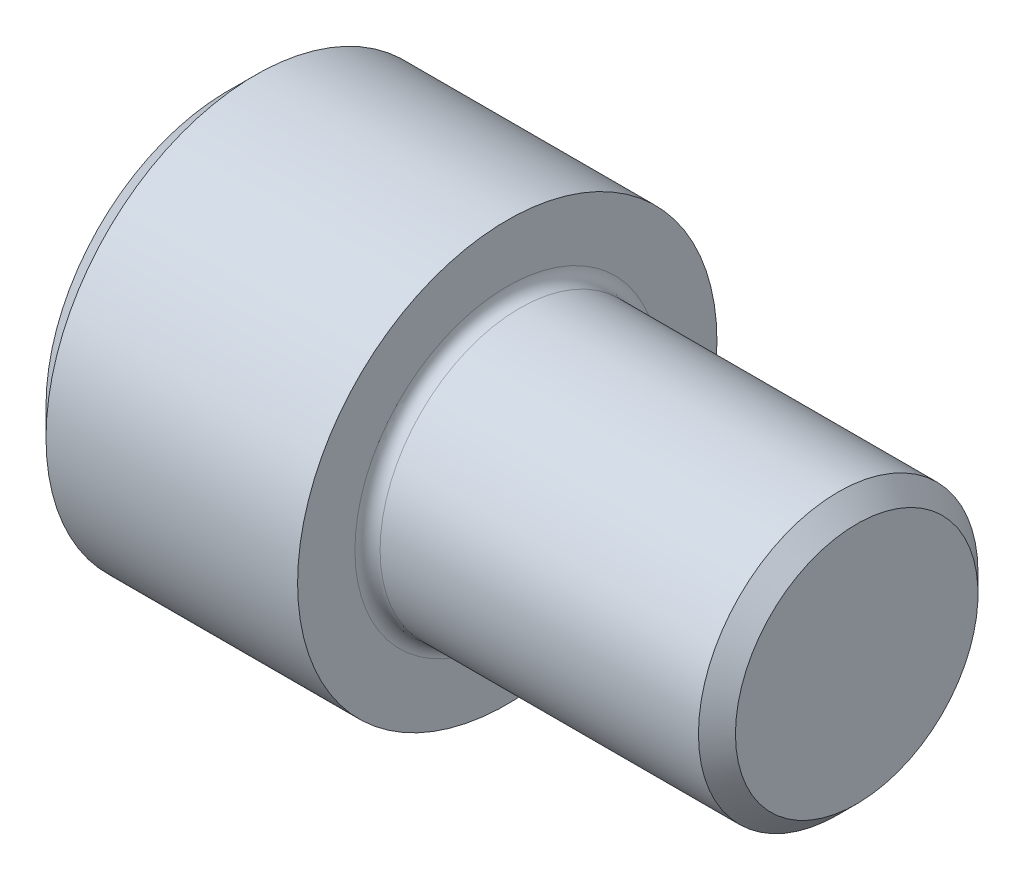
ISO-10303-21;
HEADER;
FILE_DESCRIPTION(('STEP AP214'),'2;1');
FILE_NAME('part.step','',(''),(''),'','','');
FILE_SCHEMA(('AUTOMOTIVE_DESIGN { 1 0 10303 214 1 1 1 1 }'));
ENDSEC;
DATA;
#1=APPLICATION_CONTEXT('core data for automotive mechanical design processes');
#2=APPLICATION_PROTOCOL_DEFINITION('international standard','automotive_design',2000,#1);
#3=PRODUCT_CONTEXT('',#1,'mechanical');
#4=PRODUCT('Part','Part','',(#3));
#5=PRODUCT_RELATED_PRODUCT_CATEGORY('part','',(#4));
#6=PRODUCT_DEFINITION_FORMATION('','',#4);
#7=PRODUCT_DEFINITION_CONTEXT('part definition',#1,'design');
#8=PRODUCT_DEFINITION('design','',#6,#7);
#9=PRODUCT_DEFINITION_SHAPE('','',#8);
#10=(LENGTH_UNIT() NAMED_UNIT(*) SI_UNIT(.MILLI.,.METRE.));
#11=(NAMED_UNIT(*) PLANE_ANGLE_UNIT() SI_UNIT($,.RADIAN.));
#12=(NAMED_UNIT(*) SI_UNIT($,.STERADIAN.) SOLID_ANGLE_UNIT());
#13=UNCERTAINTY_MEASURE_WITH_UNIT(LENGTH_MEASURE(1.E-05),#10,'distance_accuracy_value','');
#14=(GEOMETRIC_REPRESENTATION_CONTEXT(3) GLOBAL_UNCERTAINTY_ASSIGNED_CONTEXT((#13)) GLOBAL_UNIT_ASSIGNED_CONTEXT((#10,
#11,#12)) REPRESENTATION_CONTEXT('',''));
#15=CARTESIAN_POINT('',(0.,0.,0.));
#16=DIRECTION('',(0.,0.,1.));
#17=DIRECTION('',(1.,0.,0.));
#18=AXIS2_PLACEMENT_3D('',#15,#16,#17);
#19=CARTESIAN_POINT('',(0.,0.,0.));
#20=DIRECTION('',(-1.,0.,0.));
#21=DIRECTION('',(0.,0.,1.));
#22=AXIS2_PLACEMENT_3D('',#19,#20,#21);
#23=PLANE('',#22);
#24=DIRECTION('',(0.,-0.499999999999998,0.86602540378444));
#25=VECTOR('',#24,1.);
#26=CARTESIAN_POINT('',(0.,21.9970452561247,0.));
#27=LINE('',#26,#25);
#28=CARTESIAN_POINT('',(0.,21.9970452561247,0.));
#29=VERTEX_POINT('',#28);
#30=CARTESIAN_POINT('',(0.,10.9985226280624,19.05));
#31=VERTEX_POINT('',#30);
#32=EDGE_CURVE('E265',#29,#31,#27,.T.);
#33=ORIENTED_EDGE('',*,*,#32,.T.);
#34=DIRECTION('',(0.,1.,0.));
#35=VECTOR('',#34,1.);
#36=CARTESIAN_POINT('',(0.,-10.9985226280623,19.05));
#37=LINE('',#36,#35);
#38=CARTESIAN_POINT('',(0.,-10.9985226280623,19.05));
#39=VERTEX_POINT('',#38);
#40=EDGE_CURVE('E125',#39,#31,#37,.T.);
#41=ORIENTED_EDGE('',*,*,#40,.F.);
#42=DIRECTION('',(0.,-0.500000000000001,-0.866025403784438));
#43=VECTOR('',#42,1.);
#44=CARTESIAN_POINT('',(0.,-10.9985226280623,19.05));
#45=LINE('',#44,#43);
#46=CARTESIAN_POINT('',(0.,-21.9970452561247,0.));
#47=VERTEX_POINT('',#46);
#48=EDGE_CURVE('E268',#39,#47,#45,.T.);
#49=ORIENTED_EDGE('',*,*,#48,.T.);
#50=DIRECTION('',(0.,0.499999999999998,-0.86602540378444));
#51=VECTOR('',#50,1.);
#52=CARTESIAN_POINT('',(0.,-21.9970452561247,0.));
#53=LINE('',#52,#51);
#54=CARTESIAN_POINT('',(0.,-10.9985226280624,-19.05));
#55=VERTEX_POINT('',#54);
#56=EDGE_CURVE('E271',#47,#55,#53,.T.);
#57=ORIENTED_EDGE('',*,*,#56,.T.);
#58=DIRECTION('',(0.,-1.,0.));
#59=VECTOR('',#58,1.);
#60=CARTESIAN_POINT('',(0.,10.9985226280623,-19.05));
#61=LINE('',#60,#59);
#62=CARTESIAN_POINT('',(0.,10.9985226280623,-19.05));
#63=VERTEX_POINT('',#62);
#64=EDGE_CURVE('E274',#63,#55,#61,.T.);
#65=ORIENTED_EDGE('',*,*,#64,.F.);
#66=DIRECTION('',(0.,-0.500000000000001,-0.866025403784438));
#67=VECTOR('',#66,1.);
#68=CARTESIAN_POINT('',(0.,21.9970452561247,0.));
#69=LINE('',#68,#67);
#70=EDGE_CURVE('E120',#29,#63,#69,.T.);
#71=ORIENTED_EDGE('',*,*,#70,.F.);
#72=EDGE_LOOP('',(#33,#41,#49,#57,#65,#71));
#73=FACE_BOUND('',#72,.T.);
#74=CARTESIAN_POINT('',(0.,0.,0.));
#75=DIRECTION('',(-1.,0.,0.));
#76=DIRECTION('',(0.,0.,1.));
#77=AXIS2_PLACEMENT_3D('',#74,#75,#76);
#78=CIRCLE('',#77,33.02);
#79=CARTESIAN_POINT('',(0.,0.,33.02));
#80=VERTEX_POINT('',#79);
#81=EDGE_CURVE('E149',#80,#80,#78,.T.);
#82=ORIENTED_EDGE('',*,*,#81,.T.);
#83=EDGE_LOOP('',(#82));
#84=FACE_BOUND('',#83,.T.);
#85=ADVANCED_FACE('F33',(#73,#84),#23,.T.);
#86=CARTESIAN_POINT('',(0.,0.,0.));
#87=DIRECTION('',(1.,0.,0.));
#88=DIRECTION('',(0.,0.,-1.));
#89=AXIS2_PLACEMENT_3D('',#86,#87,#88);
#90=CONICAL_SURFACE('',#89,33.02,0.785398163397448);
#91=CARTESIAN_POINT('',(5.07999999999999,0.,0.));
#92=DIRECTION('',(-1.,0.,0.));
#93=DIRECTION('',(0.,0.,1.));
#94=AXIS2_PLACEMENT_3D('',#91,#92,#93);
#95=CIRCLE('',#94,38.1);
#96=CARTESIAN_POINT('',(5.07999999999999,0.,38.1));
#97=VERTEX_POINT('',#96);
#98=EDGE_CURVE('E146',#97,#97,#95,.T.);
#99=ORIENTED_EDGE('',*,*,#98,.T.);
#100=EDGE_LOOP('',(#99));
#101=FACE_BOUND('',#100,.T.);
#102=ORIENTED_EDGE('',*,*,#81,.F.);
#103=EDGE_LOOP('',(#102));
#104=FACE_BOUND('',#103,.T.);
#105=ADVANCED_FACE('F170',(#101,#104),#90,.T.);
#106=CARTESIAN_POINT('',(-31.75,0.,0.));
#107=DIRECTION('',(-1.,0.,0.));
#108=DIRECTION('',(0.,0.,1.));
#109=AXIS2_PLACEMENT_3D('',#106,#107,#108);
#110=CYLINDRICAL_SURFACE('',#109,38.1);
#111=CARTESIAN_POINT('',(50.8,0.,0.));
#112=DIRECTION('',(-1.,0.,0.));
#113=DIRECTION('',(0.,0.,1.));
#114=AXIS2_PLACEMENT_3D('',#111,#112,#113);
#115=CIRCLE('',#114,38.1);
#116=CARTESIAN_POINT('',(50.8,0.,38.1));
#117=VERTEX_POINT('',#116);
#118=EDGE_CURVE('E143',#117,#117,#115,.T.);
#119=ORIENTED_EDGE('',*,*,#118,.T.);
#120=EDGE_LOOP('',(#119));
#121=FACE_BOUND('',#120,.T.);
#122=ORIENTED_EDGE('',*,*,#98,.F.);
#123=EDGE_LOOP('',(#122));
#124=FACE_BOUND('',#123,.T.);
#125=ADVANCED_FACE('F175',(#121,#124),#110,.T.);
#126=CARTESIAN_POINT('',(50.8,38.1,0.));
#127=DIRECTION('',(1.,0.,0.));
#128=DIRECTION('',(0.,0.,-1.));
#129=AXIS2_PLACEMENT_3D('',#126,#127,#128);
#130=PLANE('',#129);
#131=CARTESIAN_POINT('',(50.8,0.,0.));
#132=DIRECTION('',(1.,0.,0.));
#133=DIRECTION('',(0.,0.,-1.));
#134=AXIS2_PLACEMENT_3D('',#131,#132,#133);
#135=CIRCLE('',#134,27.686);
#136=CARTESIAN_POINT('',(50.8,0.,-27.686));
#137=VERTEX_POINT('',#136);
#138=EDGE_CURVE('E41',#137,#137,#135,.F.);
#139=ORIENTED_EDGE('',*,*,#138,.T.);
#140=EDGE_LOOP('',(#139));
#141=FACE_BOUND('',#140,.T.);
#142=ORIENTED_EDGE('',*,*,#118,.F.);
#143=EDGE_LOOP('',(#142));
#144=FACE_BOUND('',#143,.T.);
#145=ADVANCED_FACE('F154',(#141,#144),#130,.T.);
#146=CARTESIAN_POINT('',(-31.75,0.,0.));
#147=DIRECTION('',(-1.,0.,0.));
#148=DIRECTION('',(0.,0.,1.));
#149=AXIS2_PLACEMENT_3D('',#146,#147,#148);
#150=CYLINDRICAL_SURFACE('',#149,25.4);
#151=CARTESIAN_POINT('',(53.086,0.,0.));
#152=DIRECTION('',(1.,0.,0.));
#153=DIRECTION('',(0.,0.,-1.));
#154=AXIS2_PLACEMENT_3D('',#151,#152,#153);
#155=CIRCLE('',#154,25.4);
#156=CARTESIAN_POINT('',(53.086,0.,-25.4));
#157=VERTEX_POINT('',#156);
#158=EDGE_CURVE('E11',#157,#157,#155,.T.);
#159=ORIENTED_EDGE('',*,*,#158,.T.);
#160=EDGE_LOOP('',(#159));
#161=FACE_BOUND('',#160,.T.);
#162=CARTESIAN_POINT('',(110.93831,0.,0.));
#163=DIRECTION('',(-1.,0.,0.));
#164=DIRECTION('',(0.,0.,1.));
#165=AXIS2_PLACEMENT_3D('',#162,#163,#164);
#166=CIRCLE('',#165,25.4);
#167=CARTESIAN_POINT('',(110.93831,0.,25.4));
#168=VERTEX_POINT('',#167);
#169=EDGE_CURVE('E140',#168,#168,#166,.T.);
#170=ORIENTED_EDGE('',*,*,#169,.T.);
#171=EDGE_LOOP('',(#170));
#172=FACE_BOUND('',#171,.T.);
#173=ADVANCED_FACE('F185',(#161,#172),#150,.T.);
#174=CARTESIAN_POINT('',(114.3,0.,0.));
#175=DIRECTION('',(-1.,0.,0.));
#176=DIRECTION('',(0.,0.,1.));
#177=AXIS2_PLACEMENT_3D('',#174,#175,#176);
#178=CONICAL_SURFACE('',#177,22.03831,0.78539816339747);
#179=ORIENTED_EDGE('',*,*,#169,.F.);
#180=EDGE_LOOP('',(#179));
#181=FACE_BOUND('',#180,.T.);
#182=CARTESIAN_POINT('',(114.3,0.,0.));
#183=DIRECTION('',(-1.,0.,0.));
#184=DIRECTION('',(0.,0.,1.));
#185=AXIS2_PLACEMENT_3D('',#182,#183,#184);
#186=CIRCLE('',#185,22.03831);
#187=CARTESIAN_POINT('',(114.3,0.,22.03831));
#188=VERTEX_POINT('',#187);
#189=EDGE_CURVE('E136',#188,#188,#186,.T.);
#190=ORIENTED_EDGE('',*,*,#189,.T.);
#191=EDGE_LOOP('',(#190));
#192=FACE_BOUND('',#191,.T.);
#193=ADVANCED_FACE('F165',(#181,#192),#178,.T.);
#194=CARTESIAN_POINT('',(114.3,22.03831,0.));
#195=DIRECTION('',(1.,0.,0.));
#196=DIRECTION('',(0.,0.,-1.));
#197=AXIS2_PLACEMENT_3D('',#194,#195,#196);
#198=PLANE('',#197);
#199=ORIENTED_EDGE('',*,*,#189,.F.);
#200=EDGE_LOOP('',(#199));
#201=FACE_BOUND('',#200,.T.);
#202=ADVANCED_FACE('F158',(#201),#198,.T.);
#203=CARTESIAN_POINT('',(53.086,0.,0.));
#204=DIRECTION('',(1.,0.,0.));
#205=DIRECTION('',(0.,0.,-1.));
#206=AXIS2_PLACEMENT_3D('',#203,#204,#205);
#207=TOROIDAL_SURFACE('',#206,27.686,2.286);
#208=ORIENTED_EDGE('',*,*,#158,.F.);
#209=EDGE_LOOP('',(#208));
#210=FACE_BOUND('',#209,.T.);
#211=ORIENTED_EDGE('',*,*,#138,.F.);
#212=EDGE_LOOP('',(#211));
#213=FACE_BOUND('',#212,.T.);
#214=ADVANCED_FACE('F35',(#210,#213),#207,.F.);
#215=CARTESIAN_POINT('',(25.273,21.9970452561247,0.));
#216=DIRECTION('',(0.,-0.86602540378444,-0.499999999999998));
#217=DIRECTION('',(0.,0.499999999999998,-0.86602540378444));
#218=AXIS2_PLACEMENT_3D('',#215,#216,#217);
#219=PLANE('',#218);
#220=ORIENTED_EDGE('',*,*,#32,.F.);
#221=DIRECTION('',(-1.,0.,0.));
#222=VECTOR('',#221,1.);
#223=CARTESIAN_POINT('',(25.273,21.9970452561247,0.));
#224=LINE('',#223,#222);
#225=CARTESIAN_POINT('',(25.273,21.9970452561247,0.));
#226=VERTEX_POINT('',#225);
#227=EDGE_CURVE('E264',#226,#29,#224,.T.);
#228=ORIENTED_EDGE('',*,*,#227,.F.);
#229=DIRECTION('',(0.,-0.499999999999998,0.86602540378444));
#230=VECTOR('',#229,1.);
#231=CARTESIAN_POINT('',(25.273,21.9970452561247,0.));
#232=LINE('',#231,#230);
#233=CARTESIAN_POINT('',(25.273,16.4977839420936,9.52499999999997));
#234=VERTEX_POINT('',#233);
#235=EDGE_CURVE('E48',#226,#234,#232,.T.);
#236=ORIENTED_EDGE('',*,*,#235,.T.);
#237=CARTESIAN_POINT('',(25.273,10.9985226280624,19.05));
#238=VERTEX_POINT('',#237);
#239=EDGE_CURVE('E106',#234,#238,#232,.T.);
#240=ORIENTED_EDGE('',*,*,#239,.T.);
#241=DIRECTION('',(-1.,0.,0.));
#242=VECTOR('',#241,1.);
#243=CARTESIAN_POINT('',(25.273,10.9985226280624,19.05));
#244=LINE('',#243,#242);
#245=EDGE_CURVE('E118',#238,#31,#244,.T.);
#246=ORIENTED_EDGE('',*,*,#245,.T.);
#247=EDGE_LOOP('',(#220,#228,#236,#240,#246));
#248=FACE_BOUND('',#247,.T.);
#249=ADVANCED_FACE('F117',(#248),#219,.T.);
#250=CARTESIAN_POINT('',(25.273,-10.9985226280623,19.05));
#251=DIRECTION('',(0.,0.,1.));
#252=DIRECTION('',(0.,-1.,0.));
#253=AXIS2_PLACEMENT_3D('',#250,#251,#252);
#254=PLANE('',#253);
#255=ORIENTED_EDGE('',*,*,#40,.T.);
#256=ORIENTED_EDGE('',*,*,#245,.F.);
#257=DIRECTION('',(0.,1.,0.));
#258=VECTOR('',#257,1.);
#259=CARTESIAN_POINT('',(25.273,-10.9985226280623,19.05));
#260=LINE('',#259,#258);
#261=CARTESIAN_POINT('',(25.273,0.,19.05));
#262=VERTEX_POINT('',#261);
#263=EDGE_CURVE('E104',#262,#238,#260,.T.);
#264=ORIENTED_EDGE('',*,*,#263,.F.);
#265=CARTESIAN_POINT('',(25.273,-10.9985226280623,19.05));
#266=VERTEX_POINT('',#265);
#267=EDGE_CURVE('E114',#266,#262,#260,.T.);
#268=ORIENTED_EDGE('',*,*,#267,.F.);
#269=DIRECTION('',(-1.,0.,0.));
#270=VECTOR('',#269,1.);
#271=CARTESIAN_POINT('',(25.273,-10.9985226280623,19.05));
#272=LINE('',#271,#270);
#273=EDGE_CURVE('E127',#266,#39,#272,.T.);
#274=ORIENTED_EDGE('',*,*,#273,.T.);
#275=EDGE_LOOP('',(#255,#256,#264,#268,#274));
#276=FACE_BOUND('',#275,.T.);
#277=ADVANCED_FACE('F122',(#276),#254,.F.);
#278=CARTESIAN_POINT('',(25.273,-10.9985226280623,19.05));
#279=DIRECTION('',(0.,0.866025403784438,-0.500000000000001));
#280=DIRECTION('',(0.,0.500000000000001,0.866025403784438));
#281=AXIS2_PLACEMENT_3D('',#278,#279,#280);
#282=PLANE('',#281);
#283=ORIENTED_EDGE('',*,*,#48,.F.);
#284=ORIENTED_EDGE('',*,*,#273,.F.);
#285=DIRECTION('',(0.,-0.500000000000001,-0.866025403784438));
#286=VECTOR('',#285,1.);
#287=CARTESIAN_POINT('',(25.273,-10.9985226280623,19.05));
#288=LINE('',#287,#286);
#289=CARTESIAN_POINT('',(25.273,-16.4977839420935,9.52500000000002));
#290=VERTEX_POINT('',#289);
#291=EDGE_CURVE('E245',#266,#290,#288,.T.);
#292=ORIENTED_EDGE('',*,*,#291,.T.);
#293=CARTESIAN_POINT('',(25.273,-21.9970452561247,0.));
#294=VERTEX_POINT('',#293);
#295=EDGE_CURVE('E247',#290,#294,#288,.T.);
#296=ORIENTED_EDGE('',*,*,#295,.T.);
#297=DIRECTION('',(-1.,0.,0.));
#298=VECTOR('',#297,1.);
#299=CARTESIAN_POINT('',(25.273,-21.9970452561247,0.));
#300=LINE('',#299,#298);
#301=EDGE_CURVE('E132',#294,#47,#300,.T.);
#302=ORIENTED_EDGE('',*,*,#301,.T.);
#303=EDGE_LOOP('',(#283,#284,#292,#296,#302));
#304=FACE_BOUND('',#303,.T.);
#305=ADVANCED_FACE('F197',(#304),#282,.T.);
#306=CARTESIAN_POINT('',(25.273,-21.9970452561247,0.));
#307=DIRECTION('',(0.,0.86602540378444,0.499999999999998));
#308=DIRECTION('',(0.,-0.499999999999998,0.86602540378444));
#309=AXIS2_PLACEMENT_3D('',#306,#307,#308);
#310=PLANE('',#309);
#311=ORIENTED_EDGE('',*,*,#56,.F.);
#312=ORIENTED_EDGE('',*,*,#301,.F.);
#313=DIRECTION('',(0.,0.499999999999998,-0.86602540378444));
#314=VECTOR('',#313,1.);
#315=CARTESIAN_POINT('',(25.273,-21.9970452561247,0.));
#316=LINE('',#315,#314);
#317=CARTESIAN_POINT('',(25.273,-16.4977839420936,-9.52499999999997));
#318=VERTEX_POINT('',#317);
#319=EDGE_CURVE('E250',#294,#318,#316,.T.);
#320=ORIENTED_EDGE('',*,*,#319,.T.);
#321=CARTESIAN_POINT('',(25.273,-10.9985226280624,-19.05));
#322=VERTEX_POINT('',#321);
#323=EDGE_CURVE('E254',#318,#322,#316,.T.);
#324=ORIENTED_EDGE('',*,*,#323,.T.);
#325=DIRECTION('',(-1.,0.,0.));
#326=VECTOR('',#325,1.);
#327=CARTESIAN_POINT('',(25.273,-10.9985226280624,-19.05));
#328=LINE('',#327,#326);
#329=EDGE_CURVE('E283',#322,#55,#328,.T.);
#330=ORIENTED_EDGE('',*,*,#329,.T.);
#331=EDGE_LOOP('',(#311,#312,#320,#324,#330));
#332=FACE_BOUND('',#331,.T.);
#333=ADVANCED_FACE('F200',(#332),#310,.T.);
#334=CARTESIAN_POINT('',(25.273,10.9985226280623,-19.05));
#335=DIRECTION('',(0.,0.,-1.));
#336=DIRECTION('',(0.,1.,0.));
#337=AXIS2_PLACEMENT_3D('',#334,#335,#336);
#338=PLANE('',#337);
#339=ORIENTED_EDGE('',*,*,#64,.T.);
#340=ORIENTED_EDGE('',*,*,#329,.F.);
#341=DIRECTION('',(0.,-1.,0.));
#342=VECTOR('',#341,1.);
#343=CARTESIAN_POINT('',(25.273,10.9985226280623,-19.05));
#344=LINE('',#343,#342);
#345=CARTESIAN_POINT('',(25.273,0.,-19.05));
#346=VERTEX_POINT('',#345);
#347=EDGE_CURVE('E258',#346,#322,#344,.T.);
#348=ORIENTED_EDGE('',*,*,#347,.F.);
#349=CARTESIAN_POINT('',(25.273,10.9985226280623,-19.05));
#350=VERTEX_POINT('',#349);
#351=EDGE_CURVE('E259',#350,#346,#344,.T.);
#352=ORIENTED_EDGE('',*,*,#351,.F.);
#353=DIRECTION('',(-1.,0.,0.));
#354=VECTOR('',#353,1.);
#355=CARTESIAN_POINT('',(25.273,10.9985226280623,-19.05));
#356=LINE('',#355,#354);
#357=EDGE_CURVE('E280',#350,#63,#356,.T.);
#358=ORIENTED_EDGE('',*,*,#357,.T.);
#359=EDGE_LOOP('',(#339,#340,#348,#352,#358));
#360=FACE_BOUND('',#359,.T.);
#361=ADVANCED_FACE('F204',(#360),#338,.F.);
#362=CARTESIAN_POINT('',(25.273,21.9970452561247,0.));
#363=DIRECTION('',(0.,0.866025403784438,-0.500000000000001));
#364=DIRECTION('',(0.,0.500000000000001,0.866025403784438));
#365=AXIS2_PLACEMENT_3D('',#362,#363,#364);
#366=PLANE('',#365);
#367=ORIENTED_EDGE('',*,*,#70,.T.);
#368=ORIENTED_EDGE('',*,*,#357,.F.);
#369=DIRECTION('',(0.,-0.500000000000001,-0.866025403784438));
#370=VECTOR('',#369,1.);
#371=CARTESIAN_POINT('',(25.273,21.9970452561247,0.));
#372=LINE('',#371,#370);
#373=CARTESIAN_POINT('',(25.273,16.4977839420935,-9.52500000000003));
#374=VERTEX_POINT('',#373);
#375=EDGE_CURVE('E262',#374,#350,#372,.T.);
#376=ORIENTED_EDGE('',*,*,#375,.F.);
#377=EDGE_CURVE('E236',#226,#374,#372,.T.);
#378=ORIENTED_EDGE('',*,*,#377,.F.);
#379=ORIENTED_EDGE('',*,*,#227,.T.);
#380=EDGE_LOOP('',(#367,#368,#376,#378,#379));
#381=FACE_BOUND('',#380,.T.);
#382=ADVANCED_FACE('F208',(#381),#366,.F.);
#383=CARTESIAN_POINT('',(25.273,10.9985226280624,19.05));
#384=DIRECTION('',(-1.,0.,0.));
#385=DIRECTION('',(0.,0.,1.));
#386=AXIS2_PLACEMENT_3D('',#383,#384,#385);
#387=PLANE('',#386);
#388=CARTESIAN_POINT('',(25.273,0.,0.));
#389=DIRECTION('',(-1.,0.,0.));
#390=DIRECTION('',(0.,0.,1.));
#391=AXIS2_PLACEMENT_3D('',#388,#389,#390);
#392=CIRCLE('',#391,19.05);
#393=EDGE_CURVE('E126',#290,#262,#392,.T.);
#394=ORIENTED_EDGE('',*,*,#393,.F.);
#395=ORIENTED_EDGE('',*,*,#291,.F.);
#396=ORIENTED_EDGE('',*,*,#267,.T.);
#397=EDGE_LOOP('',(#394,#395,#396));
#398=FACE_BOUND('',#397,.T.);
#399=ADVANCED_FACE('F212',(#398),#387,.T.);
#400=EDGE_CURVE('E130',#318,#290,#392,.T.);
#401=ORIENTED_EDGE('',*,*,#400,.F.);
#402=ORIENTED_EDGE('',*,*,#319,.F.);
#403=ORIENTED_EDGE('',*,*,#295,.F.);
#404=EDGE_LOOP('',(#401,#402,#403));
#405=FACE_BOUND('',#404,.T.);
#406=ADVANCED_FACE('F215',(#405),#387,.T.);
#407=EDGE_CURVE('E289',#346,#318,#392,.T.);
#408=ORIENTED_EDGE('',*,*,#407,.F.);
#409=ORIENTED_EDGE('',*,*,#347,.T.);
#410=ORIENTED_EDGE('',*,*,#323,.F.);
#411=EDGE_LOOP('',(#408,#409,#410));
#412=FACE_BOUND('',#411,.T.);
#413=ADVANCED_FACE('F220',(#412),#387,.T.);
#414=EDGE_CURVE('E239',#374,#346,#392,.T.);
#415=ORIENTED_EDGE('',*,*,#414,.F.);
#416=ORIENTED_EDGE('',*,*,#375,.T.);
#417=ORIENTED_EDGE('',*,*,#351,.T.);
#418=EDGE_LOOP('',(#415,#416,#417));
#419=FACE_BOUND('',#418,.T.);
#420=ADVANCED_FACE('F227',(#419),#387,.T.);
#421=EDGE_CURVE('E137',#234,#374,#392,.T.);
#422=ORIENTED_EDGE('',*,*,#421,.F.);
#423=ORIENTED_EDGE('',*,*,#235,.F.);
#424=ORIENTED_EDGE('',*,*,#377,.T.);
#425=EDGE_LOOP('',(#422,#423,#424));
#426=FACE_BOUND('',#425,.T.);
#427=ADVANCED_FACE('F223',(#426),#387,.T.);
#428=EDGE_CURVE('E109',#262,#234,#392,.T.);
#429=ORIENTED_EDGE('',*,*,#428,.F.);
#430=ORIENTED_EDGE('',*,*,#263,.T.);
#431=ORIENTED_EDGE('',*,*,#239,.F.);
#432=EDGE_LOOP('',(#429,#430,#431));
#433=FACE_BOUND('',#432,.T.);
#434=ADVANCED_FACE('F105',(#433),#387,.T.);
#435=CARTESIAN_POINT('',(25.273,0.,0.));
#436=DIRECTION('',(-1.,0.,0.));
#437=DIRECTION('',(0.,0.,1.));
#438=AXIS2_PLACEMENT_3D('',#435,#436,#437);
#439=CONICAL_SURFACE('',#438,19.05,1.04719755119659);
#440=CARTESIAN_POINT('',(36.2715226280625,0.,0.));
#441=VERTEX_POINT('',#440);
#442=VERTEX_LOOP('',#441);
#443=FACE_BOUND('',#442,.T.);
#444=ORIENTED_EDGE('',*,*,#428,.T.);
#445=ORIENTED_EDGE('',*,*,#421,.T.);
#446=ORIENTED_EDGE('',*,*,#414,.T.);
#447=ORIENTED_EDGE('',*,*,#407,.T.);
#448=ORIENTED_EDGE('',*,*,#400,.T.);
#449=ORIENTED_EDGE('',*,*,#393,.T.);
#450=EDGE_LOOP('',(#444,#445,#446,#447,#448,#449));
#451=FACE_BOUND('',#450,.T.);
#452=ADVANCED_FACE('F192',(#443,#451),#439,.F.);
#453=CLOSED_SHELL('',(#85,#105,#125,#145,#173,#193,#202,#214,#249,#277,#305,#333,#361,#382,#399,
#406,#413,#420,#427,#434,#452));
#454=MANIFOLD_SOLID_BREP('B2',#453);
#455=ADVANCED_BREP_SHAPE_REPRESENTATION('',(#18,#454),#14);
#456=SHAPE_DEFINITION_REPRESENTATION(#9,#455);
ENDSEC;
END-ISO-10303-21;
